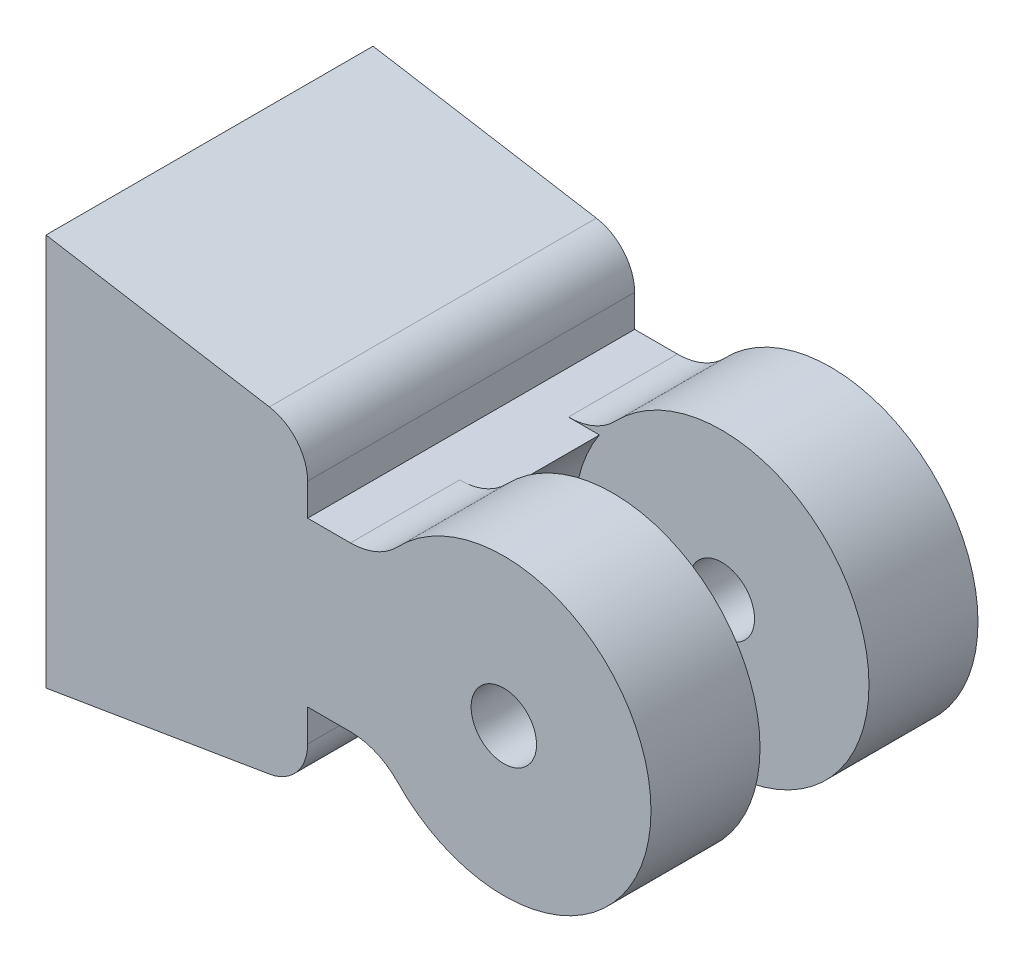
ISO-10303-21;
HEADER;
FILE_DESCRIPTION(('STEP AP214'),'2;1');
FILE_NAME('part.step','',(''),(''),'','','');
FILE_SCHEMA(('AUTOMOTIVE_DESIGN { 1 0 10303 214 1 1 1 1 }'));
ENDSEC;
DATA;
#1=APPLICATION_CONTEXT('core data for automotive mechanical design processes');
#2=APPLICATION_PROTOCOL_DEFINITION('international standard','automotive_design',2000,#1);
#3=PRODUCT_CONTEXT('',#1,'mechanical');
#4=PRODUCT('Part','Part','',(#3));
#5=PRODUCT_RELATED_PRODUCT_CATEGORY('part','',(#4));
#6=PRODUCT_DEFINITION_FORMATION('','',#4);
#7=PRODUCT_DEFINITION_CONTEXT('part definition',#1,'design');
#8=PRODUCT_DEFINITION('design','',#6,#7);
#9=PRODUCT_DEFINITION_SHAPE('','',#8);
#10=(LENGTH_UNIT() NAMED_UNIT(*) SI_UNIT(.MILLI.,.METRE.));
#11=(NAMED_UNIT(*) PLANE_ANGLE_UNIT() SI_UNIT($,.RADIAN.));
#12=(NAMED_UNIT(*) SI_UNIT($,.STERADIAN.) SOLID_ANGLE_UNIT());
#13=UNCERTAINTY_MEASURE_WITH_UNIT(LENGTH_MEASURE(1.E-05),#10,'distance_accuracy_value','');
#14=(GEOMETRIC_REPRESENTATION_CONTEXT(3) GLOBAL_UNCERTAINTY_ASSIGNED_CONTEXT((#13)) GLOBAL_UNIT_ASSIGNED_CONTEXT((#10,
#11,#12)) REPRESENTATION_CONTEXT('',''));
#15=CARTESIAN_POINT('',(0.,0.,0.));
#16=DIRECTION('',(0.,0.,1.));
#17=DIRECTION('',(1.,0.,0.));
#18=AXIS2_PLACEMENT_3D('',#15,#16,#17);
#19=CARTESIAN_POINT('',(70.,0.,25.));
#20=DIRECTION('',(0.,0.,1.));
#21=DIRECTION('',(1.,0.,0.));
#22=AXIS2_PLACEMENT_3D('',#19,#20,#21);
#23=CYLINDRICAL_SURFACE('',#22,22.5);
#24=CARTESIAN_POINT('',(70.,0.,50.));
#25=DIRECTION('',(0.,0.,1.));
#26=DIRECTION('',(1.,0.,0.));
#27=AXIS2_PLACEMENT_3D('',#24,#25,#26);
#28=CIRCLE('',#27,22.5);
#29=CARTESIAN_POINT('',(53.7639454467651,-15.5769230769231,50.));
#30=VERTEX_POINT('',#29);
#31=CARTESIAN_POINT('',(53.7639454467651,15.5769230769231,50.));
#32=VERTEX_POINT('',#31);
#33=EDGE_CURVE('E413',#30,#32,#28,.T.);
#34=ORIENTED_EDGE('',*,*,#33,.F.);
#35=DIRECTION('',(0.,0.,1.));
#36=VECTOR('',#35,1.);
#37=CARTESIAN_POINT('',(53.7639454467651,-15.5769230769231,25.));
#38=LINE('',#37,#36);
#39=CARTESIAN_POINT('',(53.763945446765,-15.5769230769231,33.33));
#40=VERTEX_POINT('',#39);
#41=EDGE_CURVE('E251',#30,#40,#38,.F.);
#42=ORIENTED_EDGE('',*,*,#41,.T.);
#43=CARTESIAN_POINT('',(70.,0.,33.33));
#44=DIRECTION('',(0.,0.,1.));
#45=DIRECTION('',(1.,0.,0.));
#46=AXIS2_PLACEMENT_3D('',#43,#44,#45);
#47=CIRCLE('',#46,22.5);
#48=CARTESIAN_POINT('',(53.763945446765,15.5769230769231,33.33));
#49=VERTEX_POINT('',#48);
#50=EDGE_CURVE('E420',#40,#49,#47,.T.);
#51=ORIENTED_EDGE('',*,*,#50,.T.);
#52=DIRECTION('',(0.,0.,1.));
#53=VECTOR('',#52,1.);
#54=CARTESIAN_POINT('',(53.7639454467651,15.5769230769231,25.));
#55=LINE('',#54,#53);
#56=EDGE_CURVE('E248',#49,#32,#55,.T.);
#57=ORIENTED_EDGE('',*,*,#56,.T.);
#58=EDGE_LOOP('',(#34,#42,#51,#57));
#59=FACE_BOUND('',#58,.T.);
#60=ADVANCED_FACE('F36',(#59),#23,.T.);
#61=CARTESIAN_POINT('',(70.,0.,25.));
#62=DIRECTION('',(0.,0.,1.));
#63=DIRECTION('',(1.,0.,0.));
#64=AXIS2_PLACEMENT_3D('',#61,#62,#63);
#65=CYLINDRICAL_SURFACE('',#64,5.);
#66=CARTESIAN_POINT('',(70.,0.,50.));
#67=DIRECTION('',(0.,0.,1.));
#68=DIRECTION('',(1.,0.,0.));
#69=AXIS2_PLACEMENT_3D('',#66,#67,#68);
#70=CIRCLE('',#69,5.);
#71=CARTESIAN_POINT('',(75.,0.,50.));
#72=VERTEX_POINT('',#71);
#73=EDGE_CURVE('E411',#72,#72,#70,.T.);
#74=ORIENTED_EDGE('',*,*,#73,.T.);
#75=EDGE_LOOP('',(#74));
#76=FACE_BOUND('',#75,.T.);
#77=CARTESIAN_POINT('',(70.,0.,33.33));
#78=DIRECTION('',(0.,0.,-1.));
#79=DIRECTION('',(-1.,0.,0.));
#80=AXIS2_PLACEMENT_3D('',#77,#78,#79);
#81=CIRCLE('',#80,5.);
#82=CARTESIAN_POINT('',(65.,0.,33.33));
#83=VERTEX_POINT('',#82);
#84=EDGE_CURVE('E185',#83,#83,#81,.F.);
#85=ORIENTED_EDGE('',*,*,#84,.F.);
#86=EDGE_LOOP('',(#85));
#87=FACE_BOUND('',#86,.T.);
#88=ADVANCED_FACE('F337',(#76,#87),#65,.F.);
#89=CARTESIAN_POINT('',(40.,-23.3349995626465,50.));
#90=DIRECTION('',(-1.,0.,0.));
#91=DIRECTION('',(0.,0.,1.));
#92=AXIS2_PLACEMENT_3D('',#89,#90,#91);
#93=PLANE('',#92);
#94=DIRECTION('',(0.,1.,0.));
#95=VECTOR('',#94,1.);
#96=CARTESIAN_POINT('',(40.,-23.3349995626465,50.));
#97=LINE('',#96,#95);
#98=CARTESIAN_POINT('',(40.,-17.4048662851288,50.));
#99=VERTEX_POINT('',#98);
#100=CARTESIAN_POINT('',(40.,-12.5,50.));
#101=VERTEX_POINT('',#100);
#102=EDGE_CURVE('E160',#99,#101,#97,.T.);
#103=ORIENTED_EDGE('',*,*,#102,.F.);
#104=DIRECTION('',(0.,0.,-1.));
#105=VECTOR('',#104,1.);
#106=CARTESIAN_POINT('',(40.,-17.4048662851288,50.));
#107=LINE('',#106,#105);
#108=CARTESIAN_POINT('',(40.,-17.4048662851288,0.));
#109=VERTEX_POINT('',#108);
#110=EDGE_CURVE('E280',#99,#109,#107,.T.);
#111=ORIENTED_EDGE('',*,*,#110,.T.);
#112=DIRECTION('',(0.,1.,0.));
#113=VECTOR('',#112,1.);
#114=CARTESIAN_POINT('',(40.,-23.3349995626465,0.));
#115=LINE('',#114,#113);
#116=CARTESIAN_POINT('',(40.,-12.5,0.));
#117=VERTEX_POINT('',#116);
#118=EDGE_CURVE('E189',#109,#117,#115,.T.);
#119=ORIENTED_EDGE('',*,*,#118,.T.);
#120=DIRECTION('',(0.,0.,-1.));
#121=VECTOR('',#120,1.);
#122=CARTESIAN_POINT('',(40.,-12.5,25.));
#123=LINE('',#122,#121);
#124=EDGE_CURVE('E180',#101,#117,#123,.T.);
#125=ORIENTED_EDGE('',*,*,#124,.F.);
#126=EDGE_LOOP('',(#103,#111,#119,#125));
#127=FACE_BOUND('',#126,.T.);
#128=ADVANCED_FACE('F187',(#127),#93,.F.);
#129=CARTESIAN_POINT('',(70.,0.,25.));
#130=DIRECTION('',(0.,0.,-1.));
#131=DIRECTION('',(-1.,0.,0.));
#132=AXIS2_PLACEMENT_3D('',#129,#130,#131);
#133=CYLINDRICAL_SURFACE('',#132,22.5);
#134=CARTESIAN_POINT('',(70.,0.,16.67));
#135=DIRECTION('',(0.,0.,1.));
#136=DIRECTION('',(1.,0.,0.));
#137=AXIS2_PLACEMENT_3D('',#134,#135,#136);
#138=CIRCLE('',#137,22.5);
#139=CARTESIAN_POINT('',(53.763945446765,-15.5769230769231,16.67));
#140=VERTEX_POINT('',#139);
#141=CARTESIAN_POINT('',(53.763945446765,15.5769230769231,16.67));
#142=VERTEX_POINT('',#141);
#143=EDGE_CURVE('E405',#140,#142,#138,.T.);
#144=ORIENTED_EDGE('',*,*,#143,.F.);
#145=DIRECTION('',(0.,0.,-1.));
#146=VECTOR('',#145,1.);
#147=CARTESIAN_POINT('',(53.7639454467651,-15.5769230769231,25.));
#148=LINE('',#147,#146);
#149=CARTESIAN_POINT('',(53.7639454467651,-15.5769230769231,0.));
#150=VERTEX_POINT('',#149);
#151=EDGE_CURVE('E237',#140,#150,#148,.T.);
#152=ORIENTED_EDGE('',*,*,#151,.T.);
#153=CARTESIAN_POINT('',(70.,0.,0.));
#154=DIRECTION('',(0.,0.,1.));
#155=DIRECTION('',(1.,0.,0.));
#156=AXIS2_PLACEMENT_3D('',#153,#154,#155);
#157=CIRCLE('',#156,22.5);
#158=CARTESIAN_POINT('',(53.7639454467651,15.5769230769231,0.));
#159=VERTEX_POINT('',#158);
#160=EDGE_CURVE('E313',#150,#159,#157,.T.);
#161=ORIENTED_EDGE('',*,*,#160,.T.);
#162=DIRECTION('',(0.,0.,-1.));
#163=VECTOR('',#162,1.);
#164=CARTESIAN_POINT('',(53.7639454467651,15.5769230769231,25.));
#165=LINE('',#164,#163);
#166=EDGE_CURVE('E227',#159,#142,#165,.F.);
#167=ORIENTED_EDGE('',*,*,#166,.T.);
#168=EDGE_LOOP('',(#144,#152,#161,#167));
#169=FACE_BOUND('',#168,.T.);
#170=ADVANCED_FACE('F360',(#169),#133,.T.);
#171=CARTESIAN_POINT('',(70.,0.,25.));
#172=DIRECTION('',(0.,0.,-1.));
#173=DIRECTION('',(-1.,0.,0.));
#174=AXIS2_PLACEMENT_3D('',#171,#172,#173);
#175=CYLINDRICAL_SURFACE('',#174,5.);
#176=CARTESIAN_POINT('',(70.,0.,0.));
#177=DIRECTION('',(0.,0.,1.));
#178=DIRECTION('',(1.,0.,0.));
#179=AXIS2_PLACEMENT_3D('',#176,#177,#178);
#180=CIRCLE('',#179,5.);
#181=CARTESIAN_POINT('',(75.,0.,0.));
#182=VERTEX_POINT('',#181);
#183=EDGE_CURVE('E192',#182,#182,#180,.T.);
#184=ORIENTED_EDGE('',*,*,#183,.F.);
#185=EDGE_LOOP('',(#184));
#186=FACE_BOUND('',#185,.T.);
#187=CARTESIAN_POINT('',(70.,0.,16.67));
#188=DIRECTION('',(0.,0.,1.));
#189=DIRECTION('',(1.,0.,0.));
#190=AXIS2_PLACEMENT_3D('',#187,#188,#189);
#191=CIRCLE('',#190,5.);
#192=CARTESIAN_POINT('',(75.,0.,16.67));
#193=VERTEX_POINT('',#192);
#194=EDGE_CURVE('E228',#193,#193,#191,.T.);
#195=ORIENTED_EDGE('',*,*,#194,.T.);
#196=EDGE_LOOP('',(#195));
#197=FACE_BOUND('',#196,.T.);
#198=ADVANCED_FACE('F357',(#186,#197),#175,.F.);
#199=CARTESIAN_POINT('',(40.,12.5,0.));
#200=VERTEX_POINT('',#199);
#201=CARTESIAN_POINT('',(40.,17.4048662851288,0.));
#202=VERTEX_POINT('',#201);
#203=EDGE_CURVE('E220',#200,#202,#115,.T.);
#204=ORIENTED_EDGE('',*,*,#203,.T.);
#205=DIRECTION('',(0.,0.,-1.));
#206=VECTOR('',#205,1.);
#207=CARTESIAN_POINT('',(40.,17.4048662851288,50.));
#208=LINE('',#207,#206);
#209=CARTESIAN_POINT('',(40.,17.4048662851288,50.));
#210=VERTEX_POINT('',#209);
#211=EDGE_CURVE('E11',#202,#210,#208,.F.);
#212=ORIENTED_EDGE('',*,*,#211,.T.);
#213=CARTESIAN_POINT('',(40.,12.5,50.));
#214=VERTEX_POINT('',#213);
#215=EDGE_CURVE('E173',#214,#210,#97,.T.);
#216=ORIENTED_EDGE('',*,*,#215,.F.);
#217=DIRECTION('',(0.,0.,-1.));
#218=VECTOR('',#217,1.);
#219=CARTESIAN_POINT('',(40.,12.5,25.));
#220=LINE('',#219,#218);
#221=EDGE_CURVE('E191',#214,#200,#220,.T.);
#222=ORIENTED_EDGE('',*,*,#221,.T.);
#223=EDGE_LOOP('',(#204,#212,#216,#222));
#224=FACE_BOUND('',#223,.T.);
#225=ADVANCED_FACE('F325',(#224),#93,.F.);
#226=CARTESIAN_POINT('',(40.,23.3349995626465,50.));
#227=DIRECTION('',(-0.164359008451031,-0.986400586141854,0.));
#228=DIRECTION('',(0.986400586141854,-0.164359008451031,0.));
#229=AXIS2_PLACEMENT_3D('',#226,#227,#228);
#230=PLANE('',#229);
#231=DIRECTION('',(-0.986400586141854,0.164359008451031,0.));
#232=VECTOR('',#231,1.);
#233=CARTESIAN_POINT('',(40.,23.3349995626465,50.));
#234=LINE('',#233,#232);
#235=CARTESIAN_POINT('',(34.1505130591572,24.3096703881217,50.));
#236=VERTEX_POINT('',#235);
#237=CARTESIAN_POINT('',(0.,30.,50.));
#238=VERTEX_POINT('',#237);
#239=EDGE_CURVE('E208',#236,#238,#234,.T.);
#240=ORIENTED_EDGE('',*,*,#239,.F.);
#241=DIRECTION('',(0.,0.,-1.));
#242=VECTOR('',#241,1.);
#243=CARTESIAN_POINT('',(34.1505130591572,24.3096703881217,50.));
#244=LINE('',#243,#242);
#245=CARTESIAN_POINT('',(34.1505130591572,24.3096703881217,0.));
#246=VERTEX_POINT('',#245);
#247=EDGE_CURVE('E44',#236,#246,#244,.T.);
#248=ORIENTED_EDGE('',*,*,#247,.T.);
#249=DIRECTION('',(-0.986400586141854,0.164359008451031,0.));
#250=VECTOR('',#249,1.);
#251=CARTESIAN_POINT('',(40.,23.3349995626465,0.));
#252=LINE('',#251,#250);
#253=CARTESIAN_POINT('',(0.,30.,0.));
#254=VERTEX_POINT('',#253);
#255=EDGE_CURVE('E207',#246,#254,#252,.T.);
#256=ORIENTED_EDGE('',*,*,#255,.T.);
#257=DIRECTION('',(0.,0.,-1.));
#258=VECTOR('',#257,1.);
#259=CARTESIAN_POINT('',(0.,30.,50.));
#260=LINE('',#259,#258);
#261=EDGE_CURVE('E224',#238,#254,#260,.T.);
#262=ORIENTED_EDGE('',*,*,#261,.F.);
#263=EDGE_LOOP('',(#240,#248,#256,#262));
#264=FACE_BOUND('',#263,.T.);
#265=ADVANCED_FACE('F293',(#264),#230,.F.);
#266=CARTESIAN_POINT('',(0.,30.,50.));
#267=DIRECTION('',(1.,0.,0.));
#268=DIRECTION('',(0.,0.,-1.));
#269=AXIS2_PLACEMENT_3D('',#266,#267,#268);
#270=PLANE('',#269);
#271=CARTESIAN_POINT('',(0.,0.,25.));
#272=DIRECTION('',(-1.,0.,0.));
#273=DIRECTION('',(0.,0.,1.));
#274=AXIS2_PLACEMENT_3D('',#271,#272,#273);
#275=CIRCLE('',#274,10.);
#276=CARTESIAN_POINT('',(0.,0.,35.));
#277=VERTEX_POINT('',#276);
#278=EDGE_CURVE('E421',#277,#277,#275,.T.);
#279=ORIENTED_EDGE('',*,*,#278,.F.);
#280=EDGE_LOOP('',(#279));
#281=FACE_BOUND('',#280,.T.);
#282=DIRECTION('',(0.,-1.,0.));
#283=VECTOR('',#282,1.);
#284=CARTESIAN_POINT('',(0.,30.,0.));
#285=LINE('',#284,#283);
#286=CARTESIAN_POINT('',(0.,-30.,0.));
#287=VERTEX_POINT('',#286);
#288=EDGE_CURVE('E215',#254,#287,#285,.T.);
#289=ORIENTED_EDGE('',*,*,#288,.T.);
#290=DIRECTION('',(0.,0.,-1.));
#291=VECTOR('',#290,1.);
#292=CARTESIAN_POINT('',(0.,-30.,50.));
#293=LINE('',#292,#291);
#294=CARTESIAN_POINT('',(0.,-30.,50.));
#295=VERTEX_POINT('',#294);
#296=EDGE_CURVE('E172',#295,#287,#293,.T.);
#297=ORIENTED_EDGE('',*,*,#296,.F.);
#298=DIRECTION('',(0.,-1.,0.));
#299=VECTOR('',#298,1.);
#300=CARTESIAN_POINT('',(0.,30.,50.));
#301=LINE('',#300,#299);
#302=EDGE_CURVE('E210',#238,#295,#301,.T.);
#303=ORIENTED_EDGE('',*,*,#302,.F.);
#304=ORIENTED_EDGE('',*,*,#261,.T.);
#305=EDGE_LOOP('',(#289,#297,#303,#304));
#306=FACE_BOUND('',#305,.T.);
#307=ADVANCED_FACE('F305',(#281,#306),#270,.F.);
#308=CARTESIAN_POINT('',(0.,-30.,50.));
#309=DIRECTION('',(-0.164359008451031,0.986400586141854,0.));
#310=DIRECTION('',(-0.986400586141854,-0.164359008451031,0.));
#311=AXIS2_PLACEMENT_3D('',#308,#309,#310);
#312=PLANE('',#311);
#313=DIRECTION('',(0.986400586141854,0.164359008451031,0.));
#314=VECTOR('',#313,1.);
#315=CARTESIAN_POINT('',(0.,-30.,0.));
#316=LINE('',#315,#314);
#317=CARTESIAN_POINT('',(34.1505130591572,-24.3096703881217,0.));
#318=VERTEX_POINT('',#317);
#319=EDGE_CURVE('E217',#287,#318,#316,.T.);
#320=ORIENTED_EDGE('',*,*,#319,.T.);
#321=DIRECTION('',(0.,0.,-1.));
#322=VECTOR('',#321,1.);
#323=CARTESIAN_POINT('',(34.1505130591572,-24.3096703881217,50.));
#324=LINE('',#323,#322);
#325=CARTESIAN_POINT('',(34.1505130591572,-24.3096703881217,50.));
#326=VERTEX_POINT('',#325);
#327=EDGE_CURVE('E286',#318,#326,#324,.F.);
#328=ORIENTED_EDGE('',*,*,#327,.T.);
#329=DIRECTION('',(0.986400586141854,0.164359008451031,0.));
#330=VECTOR('',#329,1.);
#331=CARTESIAN_POINT('',(0.,-30.,50.));
#332=LINE('',#331,#330);
#333=EDGE_CURVE('E212',#295,#326,#332,.T.);
#334=ORIENTED_EDGE('',*,*,#333,.F.);
#335=ORIENTED_EDGE('',*,*,#296,.T.);
#336=EDGE_LOOP('',(#320,#328,#334,#335));
#337=FACE_BOUND('',#336,.T.);
#338=ADVANCED_FACE('F371',(#337),#312,.F.);
#339=CARTESIAN_POINT('',(0.,0.,50.));
#340=DIRECTION('',(0.,0.,1.));
#341=DIRECTION('',(1.,0.,0.));
#342=AXIS2_PLACEMENT_3D('',#339,#340,#341);
#343=PLANE('',#342);
#344=ORIENTED_EDGE('',*,*,#333,.T.);
#345=CARTESIAN_POINT('',(33.,-17.4048662851288,50.));
#346=DIRECTION('',(0.,0.,1.));
#347=DIRECTION('',(1.,0.,0.));
#348=AXIS2_PLACEMENT_3D('',#345,#346,#347);
#349=CIRCLE('',#348,7.);
#350=EDGE_CURVE('E167',#326,#99,#349,.T.);
#351=ORIENTED_EDGE('',*,*,#350,.T.);
#352=ORIENTED_EDGE('',*,*,#102,.T.);
#353=DIRECTION('',(-1.,0.,0.));
#354=VECTOR('',#353,1.);
#355=CARTESIAN_POINT('',(0.,-12.5,50.));
#356=LINE('',#355,#354);
#357=CARTESIAN_POINT('',(46.5479212008829,-12.5,50.));
#358=VERTEX_POINT('',#357);
#359=EDGE_CURVE('E165',#358,#101,#356,.T.);
#360=ORIENTED_EDGE('',*,*,#359,.F.);
#361=CARTESIAN_POINT('',(46.5479212008829,-22.5,50.));
#362=DIRECTION('',(0.,0.,1.));
#363=DIRECTION('',(1.,0.,0.));
#364=AXIS2_PLACEMENT_3D('',#361,#362,#363);
#365=CIRCLE('',#364,10.);
#366=EDGE_CURVE('E268',#358,#30,#365,.F.);
#367=ORIENTED_EDGE('',*,*,#366,.T.);
#368=ORIENTED_EDGE('',*,*,#33,.T.);
#369=CARTESIAN_POINT('',(46.5479212008829,22.5,50.));
#370=DIRECTION('',(0.,0.,1.));
#371=DIRECTION('',(1.,0.,0.));
#372=AXIS2_PLACEMENT_3D('',#369,#370,#371);
#373=CIRCLE('',#372,10.);
#374=CARTESIAN_POINT('',(46.5479212008829,12.5,50.));
#375=VERTEX_POINT('',#374);
#376=EDGE_CURVE('E272',#32,#375,#373,.F.);
#377=ORIENTED_EDGE('',*,*,#376,.T.);
#378=DIRECTION('',(-1.,0.,0.));
#379=VECTOR('',#378,1.);
#380=CARTESIAN_POINT('',(0.,12.5,50.));
#381=LINE('',#380,#379);
#382=EDGE_CURVE('E184',#375,#214,#381,.T.);
#383=ORIENTED_EDGE('',*,*,#382,.T.);
#384=ORIENTED_EDGE('',*,*,#215,.T.);
#385=CARTESIAN_POINT('',(33.,17.4048662851288,50.));
#386=DIRECTION('',(0.,0.,1.));
#387=DIRECTION('',(1.,0.,0.));
#388=AXIS2_PLACEMENT_3D('',#385,#386,#387);
#389=CIRCLE('',#388,7.);
#390=EDGE_CURVE('E56',#210,#236,#389,.T.);
#391=ORIENTED_EDGE('',*,*,#390,.T.);
#392=ORIENTED_EDGE('',*,*,#239,.T.);
#393=ORIENTED_EDGE('',*,*,#302,.T.);
#394=EDGE_LOOP('',(#344,#351,#352,#360,#367,#368,#377,#383,#384,#391,#392,#393));
#395=FACE_BOUND('',#394,.T.);
#396=ORIENTED_EDGE('',*,*,#73,.F.);
#397=EDGE_LOOP('',(#396));
#398=FACE_BOUND('',#397,.T.);
#399=ADVANCED_FACE('F163',(#395,#398),#343,.T.);
#400=CARTESIAN_POINT('',(0.,0.,0.));
#401=DIRECTION('',(0.,0.,1.));
#402=DIRECTION('',(1.,0.,0.));
#403=AXIS2_PLACEMENT_3D('',#400,#401,#402);
#404=PLANE('',#403);
#405=ORIENTED_EDGE('',*,*,#118,.F.);
#406=CARTESIAN_POINT('',(33.,-17.4048662851288,0.));
#407=DIRECTION('',(0.,0.,1.));
#408=DIRECTION('',(1.,0.,0.));
#409=AXIS2_PLACEMENT_3D('',#406,#407,#408);
#410=CIRCLE('',#409,7.);
#411=EDGE_CURVE('E284',#109,#318,#410,.F.);
#412=ORIENTED_EDGE('',*,*,#411,.T.);
#413=ORIENTED_EDGE('',*,*,#319,.F.);
#414=ORIENTED_EDGE('',*,*,#288,.F.);
#415=ORIENTED_EDGE('',*,*,#255,.F.);
#416=CARTESIAN_POINT('',(33.,17.4048662851288,0.));
#417=DIRECTION('',(0.,0.,1.));
#418=DIRECTION('',(1.,0.,0.));
#419=AXIS2_PLACEMENT_3D('',#416,#417,#418);
#420=CIRCLE('',#419,7.);
#421=EDGE_CURVE('E282',#246,#202,#420,.F.);
#422=ORIENTED_EDGE('',*,*,#421,.T.);
#423=ORIENTED_EDGE('',*,*,#203,.F.);
#424=DIRECTION('',(-1.,0.,0.));
#425=VECTOR('',#424,1.);
#426=CARTESIAN_POINT('',(0.,12.5,0.));
#427=LINE('',#426,#425);
#428=CARTESIAN_POINT('',(46.5479212008829,12.5,0.));
#429=VERTEX_POINT('',#428);
#430=EDGE_CURVE('E198',#429,#200,#427,.T.);
#431=ORIENTED_EDGE('',*,*,#430,.F.);
#432=CARTESIAN_POINT('',(46.5479212008829,22.5,0.));
#433=DIRECTION('',(0.,0.,1.));
#434=DIRECTION('',(1.,0.,0.));
#435=AXIS2_PLACEMENT_3D('',#432,#433,#434);
#436=CIRCLE('',#435,10.);
#437=EDGE_CURVE('E276',#429,#159,#436,.T.);
#438=ORIENTED_EDGE('',*,*,#437,.T.);
#439=ORIENTED_EDGE('',*,*,#160,.F.);
#440=CARTESIAN_POINT('',(46.5479212008829,-22.5,0.));
#441=DIRECTION('',(0.,0.,1.));
#442=DIRECTION('',(1.,0.,0.));
#443=AXIS2_PLACEMENT_3D('',#440,#441,#442);
#444=CIRCLE('',#443,10.);
#445=CARTESIAN_POINT('',(46.5479212008829,-12.5,0.));
#446=VERTEX_POINT('',#445);
#447=EDGE_CURVE('E264',#150,#446,#444,.T.);
#448=ORIENTED_EDGE('',*,*,#447,.T.);
#449=DIRECTION('',(-1.,0.,0.));
#450=VECTOR('',#449,1.);
#451=CARTESIAN_POINT('',(0.,-12.5,0.));
#452=LINE('',#451,#450);
#453=EDGE_CURVE('E231',#446,#117,#452,.T.);
#454=ORIENTED_EDGE('',*,*,#453,.T.);
#455=EDGE_LOOP('',(#405,#412,#413,#414,#415,#422,#423,#431,#438,#439,#448,#454));
#456=FACE_BOUND('',#455,.T.);
#457=ORIENTED_EDGE('',*,*,#183,.T.);
#458=EDGE_LOOP('',(#457));
#459=FACE_BOUND('',#458,.T.);
#460=ADVANCED_FACE('F298',(#456,#459),#404,.F.);
#461=CARTESIAN_POINT('',(0.,-12.5,25.));
#462=DIRECTION('',(0.,-1.,0.));
#463=DIRECTION('',(0.,0.,-1.));
#464=AXIS2_PLACEMENT_3D('',#461,#462,#463);
#465=PLANE('',#464);
#466=ORIENTED_EDGE('',*,*,#453,.F.);
#467=DIRECTION('',(0.,0.,-1.));
#468=VECTOR('',#467,1.);
#469=CARTESIAN_POINT('',(46.5479212008829,-12.5,25.));
#470=LINE('',#469,#468);
#471=CARTESIAN_POINT('',(46.5479212008829,-12.5,16.67));
#472=VERTEX_POINT('',#471);
#473=EDGE_CURVE('E245',#446,#472,#470,.F.);
#474=ORIENTED_EDGE('',*,*,#473,.T.);
#475=DIRECTION('',(1.,0.,0.));
#476=VECTOR('',#475,1.);
#477=CARTESIAN_POINT('',(70.,-12.5,16.67));
#478=LINE('',#477,#476);
#479=CARTESIAN_POINT('',(51.2917130661303,-12.5,16.67));
#480=VERTEX_POINT('',#479);
#481=EDGE_CURVE('E243',#472,#480,#478,.T.);
#482=ORIENTED_EDGE('',*,*,#481,.T.);
#483=DIRECTION('',(0.,0.,-1.));
#484=VECTOR('',#483,1.);
#485=CARTESIAN_POINT('',(51.2917130661303,-12.5,25.));
#486=LINE('',#485,#484);
#487=CARTESIAN_POINT('',(51.2917130661303,-12.5,33.33));
#488=VERTEX_POINT('',#487);
#489=EDGE_CURVE('E204',#488,#480,#486,.T.);
#490=ORIENTED_EDGE('',*,*,#489,.F.);
#491=DIRECTION('',(-1.,0.,0.));
#492=VECTOR('',#491,1.);
#493=CARTESIAN_POINT('',(70.,-12.5,33.33));
#494=LINE('',#493,#492);
#495=CARTESIAN_POINT('',(46.5479212008829,-12.5,33.33));
#496=VERTEX_POINT('',#495);
#497=EDGE_CURVE('E240',#488,#496,#494,.T.);
#498=ORIENTED_EDGE('',*,*,#497,.T.);
#499=DIRECTION('',(0.,0.,-1.));
#500=VECTOR('',#499,1.);
#501=CARTESIAN_POINT('',(46.5479212008829,-12.5,50.));
#502=LINE('',#501,#500);
#503=EDGE_CURVE('E183',#496,#358,#502,.F.);
#504=ORIENTED_EDGE('',*,*,#503,.T.);
#505=ORIENTED_EDGE('',*,*,#359,.T.);
#506=ORIENTED_EDGE('',*,*,#124,.T.);
#507=EDGE_LOOP('',(#466,#474,#482,#490,#498,#504,#505,#506));
#508=FACE_BOUND('',#507,.T.);
#509=ADVANCED_FACE('F179',(#508),#465,.T.);
#510=CARTESIAN_POINT('',(0.,12.5,25.));
#511=DIRECTION('',(0.,-1.,0.));
#512=DIRECTION('',(0.,0.,-1.));
#513=AXIS2_PLACEMENT_3D('',#510,#511,#512);
#514=PLANE('',#513);
#515=ORIENTED_EDGE('',*,*,#382,.F.);
#516=DIRECTION('',(0.,0.,1.));
#517=VECTOR('',#516,1.);
#518=CARTESIAN_POINT('',(46.5479212008829,12.5,25.));
#519=LINE('',#518,#517);
#520=CARTESIAN_POINT('',(46.5479212008829,12.5,33.33));
#521=VERTEX_POINT('',#520);
#522=EDGE_CURVE('E261',#375,#521,#519,.F.);
#523=ORIENTED_EDGE('',*,*,#522,.T.);
#524=DIRECTION('',(1.,0.,0.));
#525=VECTOR('',#524,1.);
#526=CARTESIAN_POINT('',(0.,12.5,33.33));
#527=LINE('',#526,#525);
#528=CARTESIAN_POINT('',(51.2917130661303,12.5,33.33));
#529=VERTEX_POINT('',#528);
#530=EDGE_CURVE('E259',#521,#529,#527,.T.);
#531=ORIENTED_EDGE('',*,*,#530,.T.);
#532=DIRECTION('',(0.,0.,-1.));
#533=VECTOR('',#532,1.);
#534=CARTESIAN_POINT('',(51.2917130661303,12.5,25.));
#535=LINE('',#534,#533);
#536=CARTESIAN_POINT('',(51.2917130661303,12.5,16.67));
#537=VERTEX_POINT('',#536);
#538=EDGE_CURVE('E195',#529,#537,#535,.T.);
#539=ORIENTED_EDGE('',*,*,#538,.T.);
#540=DIRECTION('',(-1.,0.,0.));
#541=VECTOR('',#540,1.);
#542=CARTESIAN_POINT('',(0.,12.5,16.67));
#543=LINE('',#542,#541);
#544=CARTESIAN_POINT('',(46.5479212008829,12.5,16.67));
#545=VERTEX_POINT('',#544);
#546=EDGE_CURVE('E253',#537,#545,#543,.T.);
#547=ORIENTED_EDGE('',*,*,#546,.T.);
#548=DIRECTION('',(0.,0.,1.));
#549=VECTOR('',#548,1.);
#550=CARTESIAN_POINT('',(46.5479212008829,12.5,0.));
#551=LINE('',#550,#549);
#552=EDGE_CURVE('E256',#545,#429,#551,.F.);
#553=ORIENTED_EDGE('',*,*,#552,.T.);
#554=ORIENTED_EDGE('',*,*,#430,.T.);
#555=ORIENTED_EDGE('',*,*,#221,.F.);
#556=EDGE_LOOP('',(#515,#523,#531,#539,#547,#553,#554,#555));
#557=FACE_BOUND('',#556,.T.);
#558=ADVANCED_FACE('F323',(#557),#514,.F.);
#559=CARTESIAN_POINT('',(70.,0.,16.67));
#560=DIRECTION('',(0.,0.,1.));
#561=DIRECTION('',(1.,0.,0.));
#562=AXIS2_PLACEMENT_3D('',#559,#560,#561);
#563=CYLINDRICAL_SURFACE('',#562,22.5);
#564=ORIENTED_EDGE('',*,*,#489,.T.);
#565=EDGE_CURVE('E232',#537,#480,#138,.T.);
#566=ORIENTED_EDGE('',*,*,#565,.F.);
#567=ORIENTED_EDGE('',*,*,#538,.F.);
#568=EDGE_CURVE('E235',#529,#488,#47,.T.);
#569=ORIENTED_EDGE('',*,*,#568,.T.);
#570=EDGE_LOOP('',(#564,#566,#567,#569));
#571=FACE_BOUND('',#570,.T.);
#572=ADVANCED_FACE('F352',(#571),#563,.F.);
#573=CARTESIAN_POINT('',(70.,0.,16.67));
#574=DIRECTION('',(0.,0.,1.));
#575=DIRECTION('',(1.,0.,0.));
#576=AXIS2_PLACEMENT_3D('',#573,#574,#575);
#577=PLANE('',#576);
#578=ORIENTED_EDGE('',*,*,#194,.F.);
#579=EDGE_LOOP('',(#578));
#580=FACE_BOUND('',#579,.T.);
#581=ORIENTED_EDGE('',*,*,#565,.T.);
#582=ORIENTED_EDGE('',*,*,#481,.F.);
#583=CARTESIAN_POINT('',(46.5479212008829,-22.5,16.67));
#584=DIRECTION('',(0.,0.,1.));
#585=DIRECTION('',(1.,0.,0.));
#586=AXIS2_PLACEMENT_3D('',#583,#584,#585);
#587=CIRCLE('',#586,10.);
#588=EDGE_CURVE('E266',#472,#140,#587,.F.);
#589=ORIENTED_EDGE('',*,*,#588,.T.);
#590=ORIENTED_EDGE('',*,*,#143,.T.);
#591=CARTESIAN_POINT('',(46.5479212008829,22.5,16.67));
#592=DIRECTION('',(0.,0.,1.));
#593=DIRECTION('',(1.,0.,0.));
#594=AXIS2_PLACEMENT_3D('',#591,#592,#593);
#595=CIRCLE('',#594,10.);
#596=EDGE_CURVE('E278',#142,#545,#595,.F.);
#597=ORIENTED_EDGE('',*,*,#596,.T.);
#598=ORIENTED_EDGE('',*,*,#546,.F.);
#599=EDGE_LOOP('',(#581,#582,#589,#590,#597,#598));
#600=FACE_BOUND('',#599,.T.);
#601=ADVANCED_FACE('F348',(#580,#600),#577,.T.);
#602=CARTESIAN_POINT('',(70.,0.,33.33));
#603=DIRECTION('',(0.,0.,-1.));
#604=DIRECTION('',(1.,0.,0.));
#605=AXIS2_PLACEMENT_3D('',#602,#603,#604);
#606=PLANE('',#605);
#607=ORIENTED_EDGE('',*,*,#568,.F.);
#608=ORIENTED_EDGE('',*,*,#530,.F.);
#609=CARTESIAN_POINT('',(46.5479212008829,22.5,33.33));
#610=DIRECTION('',(0.,0.,-1.));
#611=DIRECTION('',(-1.,0.,0.));
#612=AXIS2_PLACEMENT_3D('',#609,#610,#611);
#613=CIRCLE('',#612,10.);
#614=EDGE_CURVE('E274',#521,#49,#613,.F.);
#615=ORIENTED_EDGE('',*,*,#614,.T.);
#616=ORIENTED_EDGE('',*,*,#50,.F.);
#617=CARTESIAN_POINT('',(46.5479212008829,-22.5,33.33));
#618=DIRECTION('',(0.,0.,-1.));
#619=DIRECTION('',(-1.,0.,0.));
#620=AXIS2_PLACEMENT_3D('',#617,#618,#619);
#621=CIRCLE('',#620,10.);
#622=EDGE_CURVE('E270',#40,#496,#621,.F.);
#623=ORIENTED_EDGE('',*,*,#622,.T.);
#624=ORIENTED_EDGE('',*,*,#497,.F.);
#625=EDGE_LOOP('',(#607,#608,#615,#616,#623,#624));
#626=FACE_BOUND('',#625,.T.);
#627=ORIENTED_EDGE('',*,*,#84,.T.);
#628=EDGE_LOOP('',(#627));
#629=FACE_BOUND('',#628,.T.);
#630=ADVANCED_FACE('F351',(#626,#629),#606,.T.);
#631=CARTESIAN_POINT('',(46.5479212008829,-22.5,25.));
#632=DIRECTION('',(0.,0.,-1.));
#633=DIRECTION('',(-1.,0.,0.));
#634=AXIS2_PLACEMENT_3D('',#631,#632,#633);
#635=CYLINDRICAL_SURFACE('',#634,10.);
#636=ORIENTED_EDGE('',*,*,#588,.F.);
#637=ORIENTED_EDGE('',*,*,#473,.F.);
#638=ORIENTED_EDGE('',*,*,#447,.F.);
#639=ORIENTED_EDGE('',*,*,#151,.F.);
#640=EDGE_LOOP('',(#636,#637,#638,#639));
#641=FACE_BOUND('',#640,.T.);
#642=ADVANCED_FACE('F383',(#641),#635,.F.);
#643=CARTESIAN_POINT('',(46.5479212008829,-22.5,25.));
#644=DIRECTION('',(0.,0.,1.));
#645=DIRECTION('',(1.,0.,0.));
#646=AXIS2_PLACEMENT_3D('',#643,#644,#645);
#647=CYLINDRICAL_SURFACE('',#646,10.);
#648=ORIENTED_EDGE('',*,*,#622,.F.);
#649=ORIENTED_EDGE('',*,*,#41,.F.);
#650=ORIENTED_EDGE('',*,*,#366,.F.);
#651=ORIENTED_EDGE('',*,*,#503,.F.);
#652=EDGE_LOOP('',(#648,#649,#650,#651));
#653=FACE_BOUND('',#652,.T.);
#654=ADVANCED_FACE('F386',(#653),#647,.F.);
#655=CARTESIAN_POINT('',(46.5479212008829,22.5,25.));
#656=DIRECTION('',(0.,0.,1.));
#657=DIRECTION('',(1.,0.,0.));
#658=AXIS2_PLACEMENT_3D('',#655,#656,#657);
#659=CYLINDRICAL_SURFACE('',#658,10.);
#660=ORIENTED_EDGE('',*,*,#614,.F.);
#661=ORIENTED_EDGE('',*,*,#522,.F.);
#662=ORIENTED_EDGE('',*,*,#376,.F.);
#663=ORIENTED_EDGE('',*,*,#56,.F.);
#664=EDGE_LOOP('',(#660,#661,#662,#663));
#665=FACE_BOUND('',#664,.T.);
#666=ADVANCED_FACE('F390',(#665),#659,.F.);
#667=CARTESIAN_POINT('',(46.5479212008829,22.5,25.));
#668=DIRECTION('',(0.,0.,-1.));
#669=DIRECTION('',(-1.,0.,0.));
#670=AXIS2_PLACEMENT_3D('',#667,#668,#669);
#671=CYLINDRICAL_SURFACE('',#670,10.);
#672=ORIENTED_EDGE('',*,*,#596,.F.);
#673=ORIENTED_EDGE('',*,*,#166,.F.);
#674=ORIENTED_EDGE('',*,*,#437,.F.);
#675=ORIENTED_EDGE('',*,*,#552,.F.);
#676=EDGE_LOOP('',(#672,#673,#674,#675));
#677=FACE_BOUND('',#676,.T.);
#678=ADVANCED_FACE('F335',(#677),#671,.F.);
#679=CARTESIAN_POINT('',(33.,-17.4048662851288,50.));
#680=DIRECTION('',(0.,0.,-1.));
#681=DIRECTION('',(-1.,0.,0.));
#682=AXIS2_PLACEMENT_3D('',#679,#680,#681);
#683=CYLINDRICAL_SURFACE('',#682,7.);
#684=ORIENTED_EDGE('',*,*,#350,.F.);
#685=ORIENTED_EDGE('',*,*,#327,.F.);
#686=ORIENTED_EDGE('',*,*,#411,.F.);
#687=ORIENTED_EDGE('',*,*,#110,.F.);
#688=EDGE_LOOP('',(#684,#685,#686,#687));
#689=FACE_BOUND('',#688,.T.);
#690=ADVANCED_FACE('F310',(#689),#683,.T.);
#691=CARTESIAN_POINT('',(33.,17.4048662851288,50.));
#692=DIRECTION('',(0.,0.,-1.));
#693=DIRECTION('',(-1.,0.,0.));
#694=AXIS2_PLACEMENT_3D('',#691,#692,#693);
#695=CYLINDRICAL_SURFACE('',#694,7.);
#696=ORIENTED_EDGE('',*,*,#390,.F.);
#697=ORIENTED_EDGE('',*,*,#211,.F.);
#698=ORIENTED_EDGE('',*,*,#421,.F.);
#699=ORIENTED_EDGE('',*,*,#247,.F.);
#700=EDGE_LOOP('',(#696,#697,#698,#699));
#701=FACE_BOUND('',#700,.T.);
#702=ADVANCED_FACE('F38',(#701),#695,.T.);
#703=CARTESIAN_POINT('',(20.,0.,25.));
#704=DIRECTION('',(-1.,0.,0.));
#705=DIRECTION('',(0.,0.,1.));
#706=AXIS2_PLACEMENT_3D('',#703,#704,#705);
#707=CYLINDRICAL_SURFACE('',#706,10.);
#708=CARTESIAN_POINT('',(20.,0.,25.));
#709=DIRECTION('',(-1.,0.,0.));
#710=DIRECTION('',(0.,0.,1.));
#711=AXIS2_PLACEMENT_3D('',#708,#709,#710);
#712=CIRCLE('',#711,10.);
#713=CARTESIAN_POINT('',(20.,0.,35.));
#714=VERTEX_POINT('',#713);
#715=EDGE_CURVE('E424',#714,#714,#712,.T.);
#716=ORIENTED_EDGE('',*,*,#715,.F.);
#717=EDGE_LOOP('',(#716));
#718=FACE_BOUND('',#717,.T.);
#719=ORIENTED_EDGE('',*,*,#278,.T.);
#720=EDGE_LOOP('',(#719));
#721=FACE_BOUND('',#720,.T.);
#722=ADVANCED_FACE('F327',(#718,#721),#707,.F.);
#723=CARTESIAN_POINT('',(20.,0.,25.));
#724=DIRECTION('',(-1.,0.,0.));
#725=DIRECTION('',(0.,0.,1.));
#726=AXIS2_PLACEMENT_3D('',#723,#724,#725);
#727=PLANE('',#726);
#728=ORIENTED_EDGE('',*,*,#715,.T.);
#729=EDGE_LOOP('',(#728));
#730=FACE_BOUND('',#729,.T.);
#731=ADVANCED_FACE('F332',(#730),#727,.T.);
#732=CLOSED_SHELL('',(#60,#88,#128,#170,#198,#225,#265,#307,#338,#399,#460,#509,#558,#572,#601,
#630,#642,#654,#666,#678,#690,#702,#722,#731));
#733=MANIFOLD_SOLID_BREP('B2',#732);
#734=ADVANCED_BREP_SHAPE_REPRESENTATION('',(#18,#733),#14);
#735=SHAPE_DEFINITION_REPRESENTATION(#9,#734);
ENDSEC;
END-ISO-10303-21;
